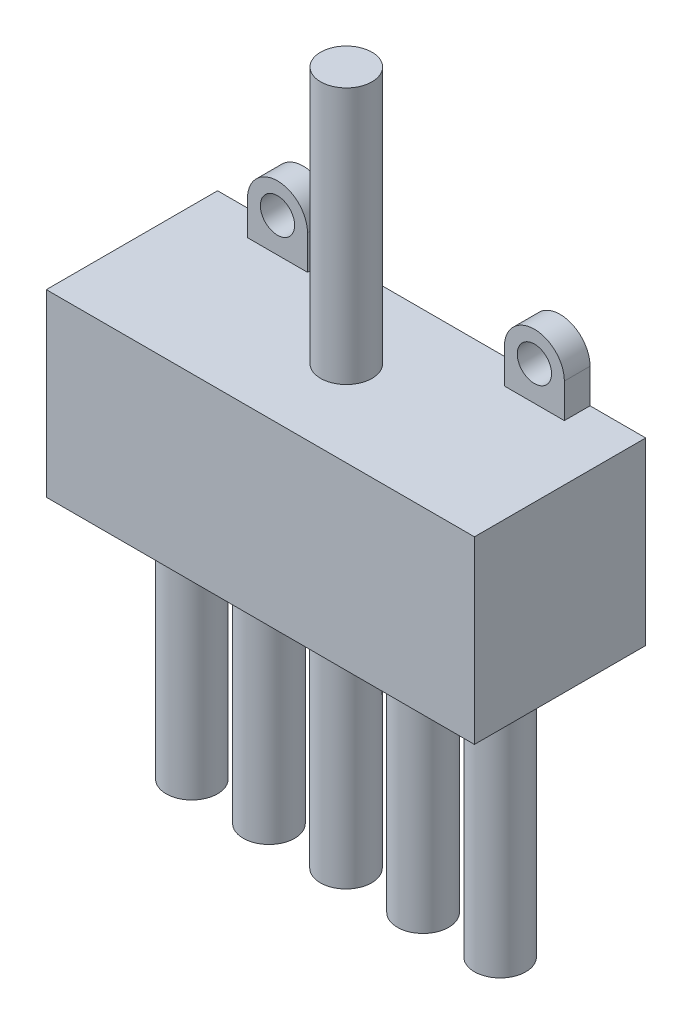
ISO-10303-21;
HEADER;
FILE_DESCRIPTION(('STEP AP214'),'2;1');
FILE_NAME('part.step','',(''),(''),'','','');
FILE_SCHEMA(('AUTOMOTIVE_DESIGN { 1 0 10303 214 1 1 1 1 }'));
ENDSEC;
DATA;
#1=APPLICATION_CONTEXT('core data for automotive mechanical design processes');
#2=APPLICATION_PROTOCOL_DEFINITION('international standard','automotive_design',2000,#1);
#3=PRODUCT_CONTEXT('',#1,'mechanical');
#4=PRODUCT('Part','Part','',(#3));
#5=PRODUCT_RELATED_PRODUCT_CATEGORY('part','',(#4));
#6=PRODUCT_DEFINITION_FORMATION('','',#4);
#7=PRODUCT_DEFINITION_CONTEXT('part definition',#1,'design');
#8=PRODUCT_DEFINITION('design','',#6,#7);
#9=PRODUCT_DEFINITION_SHAPE('','',#8);
#10=(LENGTH_UNIT() NAMED_UNIT(*) SI_UNIT(.MILLI.,.METRE.));
#11=(NAMED_UNIT(*) PLANE_ANGLE_UNIT() SI_UNIT($,.RADIAN.));
#12=(NAMED_UNIT(*) SI_UNIT($,.STERADIAN.) SOLID_ANGLE_UNIT());
#13=UNCERTAINTY_MEASURE_WITH_UNIT(LENGTH_MEASURE(1.E-05),#10,'distance_accuracy_value','');
#14=(GEOMETRIC_REPRESENTATION_CONTEXT(3) GLOBAL_UNCERTAINTY_ASSIGNED_CONTEXT((#13)) GLOBAL_UNIT_ASSIGNED_CONTEXT((#10,
#11,#12)) REPRESENTATION_CONTEXT('',''));
#15=CARTESIAN_POINT('',(0.,0.,0.));
#16=DIRECTION('',(0.,0.,1.));
#17=DIRECTION('',(1.,0.,0.));
#18=AXIS2_PLACEMENT_3D('',#15,#16,#17);
#19=CARTESIAN_POINT('',(-15.,14.5,3.));
#20=DIRECTION('',(0.,0.,-1.));
#21=DIRECTION('',(-1.,0.,0.));
#22=AXIS2_PLACEMENT_3D('',#19,#20,#21);
#23=CYLINDRICAL_SURFACE('',#22,3.5);
#24=CARTESIAN_POINT('',(-15.,14.5,0.));
#25=DIRECTION('',(0.,0.,-1.));
#26=DIRECTION('',(1.,0.,0.));
#27=AXIS2_PLACEMENT_3D('',#24,#25,#26);
#28=CIRCLE('',#27,3.5);
#29=CARTESIAN_POINT('',(-18.5,14.5,0.));
#30=VERTEX_POINT('',#29);
#31=CARTESIAN_POINT('',(-11.5,14.5,0.));
#32=VERTEX_POINT('',#31);
#33=EDGE_CURVE('E108',#30,#32,#28,.T.);
#34=ORIENTED_EDGE('',*,*,#33,.F.);
#35=DIRECTION('',(0.,0.,-1.));
#36=VECTOR('',#35,1.);
#37=CARTESIAN_POINT('',(-18.5,14.5,3.));
#38=LINE('',#37,#36);
#39=CARTESIAN_POINT('',(-18.5,14.5,3.));
#40=VERTEX_POINT('',#39);
#41=EDGE_CURVE('E12',#40,#30,#38,.T.);
#42=ORIENTED_EDGE('',*,*,#41,.F.);
#43=CARTESIAN_POINT('',(-15.,14.5,3.));
#44=DIRECTION('',(0.,0.,-1.));
#45=DIRECTION('',(1.,0.,0.));
#46=AXIS2_PLACEMENT_3D('',#43,#44,#45);
#47=CIRCLE('',#46,3.5);
#48=CARTESIAN_POINT('',(-11.5,14.5,3.));
#49=VERTEX_POINT('',#48);
#50=EDGE_CURVE('E101',#40,#49,#47,.T.);
#51=ORIENTED_EDGE('',*,*,#50,.T.);
#52=DIRECTION('',(0.,0.,-1.));
#53=VECTOR('',#52,1.);
#54=CARTESIAN_POINT('',(-11.5,14.5,3.));
#55=LINE('',#54,#53);
#56=EDGE_CURVE('E46',#49,#32,#55,.T.);
#57=ORIENTED_EDGE('',*,*,#56,.T.);
#58=EDGE_LOOP('',(#34,#42,#51,#57));
#59=FACE_BOUND('',#58,.T.);
#60=ADVANCED_FACE('F43',(#59),#23,.T.);
#61=CARTESIAN_POINT('',(-18.5,14.5,3.));
#62=DIRECTION('',(-1.,0.,0.));
#63=DIRECTION('',(0.,-1.,0.));
#64=AXIS2_PLACEMENT_3D('',#61,#62,#63);
#65=PLANE('',#64);
#66=DIRECTION('',(0.,1.,0.));
#67=VECTOR('',#66,1.);
#68=CARTESIAN_POINT('',(-18.5,14.5,0.));
#69=LINE('',#68,#67);
#70=CARTESIAN_POINT('',(-18.5,10.5,0.));
#71=VERTEX_POINT('',#70);
#72=EDGE_CURVE('E103',#71,#30,#69,.T.);
#73=ORIENTED_EDGE('',*,*,#72,.F.);
#74=DIRECTION('',(0.,0.,-1.));
#75=VECTOR('',#74,1.);
#76=CARTESIAN_POINT('',(-18.5,10.5,3.));
#77=LINE('',#76,#75);
#78=CARTESIAN_POINT('',(-18.5,10.5,3.));
#79=VERTEX_POINT('',#78);
#80=EDGE_CURVE('E52',#79,#71,#77,.T.);
#81=ORIENTED_EDGE('',*,*,#80,.F.);
#82=DIRECTION('',(0.,1.,0.));
#83=VECTOR('',#82,1.);
#84=CARTESIAN_POINT('',(-18.5,14.5,3.));
#85=LINE('',#84,#83);
#86=EDGE_CURVE('E98',#79,#40,#85,.T.);
#87=ORIENTED_EDGE('',*,*,#86,.T.);
#88=ORIENTED_EDGE('',*,*,#41,.T.);
#89=EDGE_LOOP('',(#73,#81,#87,#88));
#90=FACE_BOUND('',#89,.T.);
#91=ADVANCED_FACE('F119',(#90),#65,.T.);
#92=CARTESIAN_POINT('',(-18.5,10.5,3.));
#93=DIRECTION('',(0.,-1.,0.));
#94=DIRECTION('',(0.,0.,-1.));
#95=AXIS2_PLACEMENT_3D('',#92,#93,#94);
#96=PLANE('',#95);
#97=DIRECTION('',(-1.,0.,0.));
#98=VECTOR('',#97,1.);
#99=CARTESIAN_POINT('',(-18.5,10.5,0.));
#100=LINE('',#99,#98);
#101=CARTESIAN_POINT('',(-11.5,10.5,0.));
#102=VERTEX_POINT('',#101);
#103=EDGE_CURVE('E93',#102,#71,#100,.T.);
#104=ORIENTED_EDGE('',*,*,#103,.F.);
#105=DIRECTION('',(0.,0.,-1.));
#106=VECTOR('',#105,1.);
#107=CARTESIAN_POINT('',(-11.5,10.5,3.));
#108=LINE('',#107,#106);
#109=CARTESIAN_POINT('',(-11.5,10.5,3.));
#110=VERTEX_POINT('',#109);
#111=EDGE_CURVE('E88',#110,#102,#108,.T.);
#112=ORIENTED_EDGE('',*,*,#111,.F.);
#113=DIRECTION('',(-1.,0.,0.));
#114=VECTOR('',#113,1.);
#115=CARTESIAN_POINT('',(-18.5,10.5,3.));
#116=LINE('',#115,#114);
#117=EDGE_CURVE('E91',#110,#79,#116,.T.);
#118=ORIENTED_EDGE('',*,*,#117,.T.);
#119=ORIENTED_EDGE('',*,*,#80,.T.);
#120=EDGE_LOOP('',(#104,#112,#118,#119));
#121=FACE_BOUND('',#120,.T.);
#122=ADVANCED_FACE('F90',(#121),#96,.T.);
#123=CARTESIAN_POINT('',(-11.5,14.5,3.));
#124=DIRECTION('',(1.,0.,0.));
#125=DIRECTION('',(0.,0.,-1.));
#126=AXIS2_PLACEMENT_3D('',#123,#124,#125);
#127=PLANE('',#126);
#128=DIRECTION('',(0.,-1.,0.));
#129=VECTOR('',#128,1.);
#130=CARTESIAN_POINT('',(-11.5,14.5,0.));
#131=LINE('',#130,#129);
#132=EDGE_CURVE('E111',#32,#102,#131,.T.);
#133=ORIENTED_EDGE('',*,*,#132,.F.);
#134=ORIENTED_EDGE('',*,*,#56,.F.);
#135=DIRECTION('',(0.,-1.,0.));
#136=VECTOR('',#135,1.);
#137=CARTESIAN_POINT('',(-11.5,14.5,3.));
#138=LINE('',#137,#136);
#139=EDGE_CURVE('E97',#49,#110,#138,.T.);
#140=ORIENTED_EDGE('',*,*,#139,.T.);
#141=ORIENTED_EDGE('',*,*,#111,.T.);
#142=EDGE_LOOP('',(#133,#134,#140,#141));
#143=FACE_BOUND('',#142,.T.);
#144=ADVANCED_FACE('F100',(#143),#127,.T.);
#145=CARTESIAN_POINT('',(-15.,14.5,3.));
#146=DIRECTION('',(0.,0.,1.));
#147=DIRECTION('',(1.,0.,0.));
#148=AXIS2_PLACEMENT_3D('',#145,#146,#147);
#149=PLANE('',#148);
#150=CARTESIAN_POINT('',(-15.,14.5,3.));
#151=DIRECTION('',(0.,0.,-1.));
#152=DIRECTION('',(1.,0.,0.));
#153=AXIS2_PLACEMENT_3D('',#150,#151,#152);
#154=CIRCLE('',#153,2.);
#155=CARTESIAN_POINT('',(-13.,14.5,3.));
#156=VERTEX_POINT('',#155);
#157=EDGE_CURVE('E112',#156,#156,#154,.T.);
#158=ORIENTED_EDGE('',*,*,#157,.T.);
#159=EDGE_LOOP('',(#158));
#160=FACE_BOUND('',#159,.T.);
#161=ORIENTED_EDGE('',*,*,#50,.F.);
#162=ORIENTED_EDGE('',*,*,#86,.F.);
#163=ORIENTED_EDGE('',*,*,#117,.F.);
#164=ORIENTED_EDGE('',*,*,#139,.F.);
#165=EDGE_LOOP('',(#161,#162,#163,#164));
#166=FACE_BOUND('',#165,.T.);
#167=ADVANCED_FACE('F96',(#160,#166),#149,.T.);
#168=CARTESIAN_POINT('',(-15.,14.5,0.));
#169=DIRECTION('',(0.,0.,1.));
#170=DIRECTION('',(1.,0.,0.));
#171=AXIS2_PLACEMENT_3D('',#168,#169,#170);
#172=PLANE('',#171);
#173=CARTESIAN_POINT('',(-15.,14.5,0.));
#174=DIRECTION('',(0.,0.,-1.));
#175=DIRECTION('',(1.,0.,0.));
#176=AXIS2_PLACEMENT_3D('',#173,#174,#175);
#177=CIRCLE('',#176,2.);
#178=CARTESIAN_POINT('',(-13.,14.5,0.));
#179=VERTEX_POINT('',#178);
#180=EDGE_CURVE('E149',#179,#179,#177,.T.);
#181=ORIENTED_EDGE('',*,*,#180,.F.);
#182=EDGE_LOOP('',(#181));
#183=FACE_BOUND('',#182,.T.);
#184=ORIENTED_EDGE('',*,*,#33,.T.);
#185=ORIENTED_EDGE('',*,*,#132,.T.);
#186=ORIENTED_EDGE('',*,*,#103,.T.);
#187=ORIENTED_EDGE('',*,*,#72,.T.);
#188=EDGE_LOOP('',(#184,#185,#186,#187));
#189=FACE_BOUND('',#188,.T.);
#190=ADVANCED_FACE('F118',(#183,#189),#172,.F.);
#191=CARTESIAN_POINT('',(-15.,14.5,3.));
#192=DIRECTION('',(0.,0.,-1.));
#193=DIRECTION('',(-1.,0.,0.));
#194=AXIS2_PLACEMENT_3D('',#191,#192,#193);
#195=CYLINDRICAL_SURFACE('',#194,2.);
#196=ORIENTED_EDGE('',*,*,#157,.F.);
#197=EDGE_LOOP('',(#196));
#198=FACE_BOUND('',#197,.T.);
#199=ORIENTED_EDGE('',*,*,#180,.T.);
#200=EDGE_LOOP('',(#199));
#201=FACE_BOUND('',#200,.T.);
#202=ADVANCED_FACE('F137',(#198,#201),#195,.F.);
#203=CLOSED_SHELL('',(#60,#91,#122,#144,#167,#190,#202));
#204=MANIFOLD_SOLID_BREP('B2',#203);
#205=CARTESIAN_POINT('',(15.,14.5,3.));
#206=DIRECTION('',(0.,0.,-1.));
#207=DIRECTION('',(-1.,0.,0.));
#208=AXIS2_PLACEMENT_3D('',#205,#206,#207);
#209=CYLINDRICAL_SURFACE('',#208,3.5);
#210=CARTESIAN_POINT('',(15.,14.5,0.));
#211=DIRECTION('',(0.,0.,-1.));
#212=DIRECTION('',(-1.,0.,0.));
#213=AXIS2_PLACEMENT_3D('',#210,#211,#212);
#214=CIRCLE('',#213,3.5);
#215=CARTESIAN_POINT('',(11.5,14.5,0.));
#216=VERTEX_POINT('',#215);
#217=CARTESIAN_POINT('',(18.5,14.5,0.));
#218=VERTEX_POINT('',#217);
#219=EDGE_CURVE('E260',#216,#218,#214,.T.);
#220=ORIENTED_EDGE('',*,*,#219,.F.);
#221=DIRECTION('',(0.,0.,-1.));
#222=VECTOR('',#221,1.);
#223=CARTESIAN_POINT('',(11.5,14.5,3.));
#224=LINE('',#223,#222);
#225=CARTESIAN_POINT('',(11.5,14.5,3.));
#226=VERTEX_POINT('',#225);
#227=EDGE_CURVE('E41',#226,#216,#224,.T.);
#228=ORIENTED_EDGE('',*,*,#227,.F.);
#229=CARTESIAN_POINT('',(15.,14.5,3.));
#230=DIRECTION('',(0.,0.,-1.));
#231=DIRECTION('',(-1.,0.,0.));
#232=AXIS2_PLACEMENT_3D('',#229,#230,#231);
#233=CIRCLE('',#232,3.5);
#234=CARTESIAN_POINT('',(18.5,14.5,3.));
#235=VERTEX_POINT('',#234);
#236=EDGE_CURVE('E253',#226,#235,#233,.T.);
#237=ORIENTED_EDGE('',*,*,#236,.T.);
#238=DIRECTION('',(0.,0.,-1.));
#239=VECTOR('',#238,1.);
#240=CARTESIAN_POINT('',(18.5,14.5,3.));
#241=LINE('',#240,#239);
#242=EDGE_CURVE('E198',#235,#218,#241,.T.);
#243=ORIENTED_EDGE('',*,*,#242,.T.);
#244=EDGE_LOOP('',(#220,#228,#237,#243));
#245=FACE_BOUND('',#244,.T.);
#246=ADVANCED_FACE('F195',(#245),#209,.T.);
#247=CARTESIAN_POINT('',(11.5,14.5,3.));
#248=DIRECTION('',(-1.,0.,0.));
#249=DIRECTION('',(0.,0.,1.));
#250=AXIS2_PLACEMENT_3D('',#247,#248,#249);
#251=PLANE('',#250);
#252=DIRECTION('',(0.,1.,0.));
#253=VECTOR('',#252,1.);
#254=CARTESIAN_POINT('',(11.5,14.5,0.));
#255=LINE('',#254,#253);
#256=CARTESIAN_POINT('',(11.5,10.5,0.));
#257=VERTEX_POINT('',#256);
#258=EDGE_CURVE('E255',#257,#216,#255,.T.);
#259=ORIENTED_EDGE('',*,*,#258,.F.);
#260=DIRECTION('',(0.,0.,-1.));
#261=VECTOR('',#260,1.);
#262=CARTESIAN_POINT('',(11.5,10.5,3.));
#263=LINE('',#262,#261);
#264=CARTESIAN_POINT('',(11.5,10.5,3.));
#265=VERTEX_POINT('',#264);
#266=EDGE_CURVE('E204',#265,#257,#263,.T.);
#267=ORIENTED_EDGE('',*,*,#266,.F.);
#268=DIRECTION('',(0.,1.,0.));
#269=VECTOR('',#268,1.);
#270=CARTESIAN_POINT('',(11.5,14.5,3.));
#271=LINE('',#270,#269);
#272=EDGE_CURVE('E250',#265,#226,#271,.T.);
#273=ORIENTED_EDGE('',*,*,#272,.T.);
#274=ORIENTED_EDGE('',*,*,#227,.T.);
#275=EDGE_LOOP('',(#259,#267,#273,#274));
#276=FACE_BOUND('',#275,.T.);
#277=ADVANCED_FACE('F271',(#276),#251,.T.);
#278=CARTESIAN_POINT('',(18.5,10.5,3.));
#279=DIRECTION('',(0.,-1.,0.));
#280=DIRECTION('',(0.,0.,-1.));
#281=AXIS2_PLACEMENT_3D('',#278,#279,#280);
#282=PLANE('',#281);
#283=DIRECTION('',(-1.,0.,0.));
#284=VECTOR('',#283,1.);
#285=CARTESIAN_POINT('',(18.5,10.5,0.));
#286=LINE('',#285,#284);
#287=CARTESIAN_POINT('',(18.5,10.5,0.));
#288=VERTEX_POINT('',#287);
#289=EDGE_CURVE('E245',#288,#257,#286,.T.);
#290=ORIENTED_EDGE('',*,*,#289,.F.);
#291=DIRECTION('',(0.,0.,-1.));
#292=VECTOR('',#291,1.);
#293=CARTESIAN_POINT('',(18.5,10.5,3.));
#294=LINE('',#293,#292);
#295=CARTESIAN_POINT('',(18.5,10.5,3.));
#296=VERTEX_POINT('',#295);
#297=EDGE_CURVE('E240',#296,#288,#294,.T.);
#298=ORIENTED_EDGE('',*,*,#297,.F.);
#299=DIRECTION('',(-1.,0.,0.));
#300=VECTOR('',#299,1.);
#301=CARTESIAN_POINT('',(18.5,10.5,3.));
#302=LINE('',#301,#300);
#303=EDGE_CURVE('E243',#296,#265,#302,.T.);
#304=ORIENTED_EDGE('',*,*,#303,.T.);
#305=ORIENTED_EDGE('',*,*,#266,.T.);
#306=EDGE_LOOP('',(#290,#298,#304,#305));
#307=FACE_BOUND('',#306,.T.);
#308=ADVANCED_FACE('F242',(#307),#282,.T.);
#309=CARTESIAN_POINT('',(18.5,14.5,3.));
#310=DIRECTION('',(1.,0.,0.));
#311=DIRECTION('',(0.,1.,0.));
#312=AXIS2_PLACEMENT_3D('',#309,#310,#311);
#313=PLANE('',#312);
#314=DIRECTION('',(0.,-1.,0.));
#315=VECTOR('',#314,1.);
#316=CARTESIAN_POINT('',(18.5,14.5,0.));
#317=LINE('',#316,#315);
#318=EDGE_CURVE('E263',#218,#288,#317,.T.);
#319=ORIENTED_EDGE('',*,*,#318,.F.);
#320=ORIENTED_EDGE('',*,*,#242,.F.);
#321=DIRECTION('',(0.,-1.,0.));
#322=VECTOR('',#321,1.);
#323=CARTESIAN_POINT('',(18.5,14.5,3.));
#324=LINE('',#323,#322);
#325=EDGE_CURVE('E249',#235,#296,#324,.T.);
#326=ORIENTED_EDGE('',*,*,#325,.T.);
#327=ORIENTED_EDGE('',*,*,#297,.T.);
#328=EDGE_LOOP('',(#319,#320,#326,#327));
#329=FACE_BOUND('',#328,.T.);
#330=ADVANCED_FACE('F252',(#329),#313,.T.);
#331=CARTESIAN_POINT('',(15.,14.5,3.));
#332=DIRECTION('',(0.,0.,-1.));
#333=DIRECTION('',(-1.,0.,0.));
#334=AXIS2_PLACEMENT_3D('',#331,#332,#333);
#335=PLANE('',#334);
#336=CARTESIAN_POINT('',(15.,14.5,3.));
#337=DIRECTION('',(0.,0.,-1.));
#338=DIRECTION('',(-1.,0.,0.));
#339=AXIS2_PLACEMENT_3D('',#336,#337,#338);
#340=CIRCLE('',#339,2.);
#341=CARTESIAN_POINT('',(13.,14.5,3.));
#342=VERTEX_POINT('',#341);
#343=EDGE_CURVE('E264',#342,#342,#340,.T.);
#344=ORIENTED_EDGE('',*,*,#343,.T.);
#345=EDGE_LOOP('',(#344));
#346=FACE_BOUND('',#345,.T.);
#347=ORIENTED_EDGE('',*,*,#236,.F.);
#348=ORIENTED_EDGE('',*,*,#272,.F.);
#349=ORIENTED_EDGE('',*,*,#303,.F.);
#350=ORIENTED_EDGE('',*,*,#325,.F.);
#351=EDGE_LOOP('',(#347,#348,#349,#350));
#352=FACE_BOUND('',#351,.T.);
#353=ADVANCED_FACE('F248',(#346,#352),#335,.F.);
#354=CARTESIAN_POINT('',(15.,14.5,0.));
#355=DIRECTION('',(0.,0.,-1.));
#356=DIRECTION('',(-1.,0.,0.));
#357=AXIS2_PLACEMENT_3D('',#354,#355,#356);
#358=PLANE('',#357);
#359=CARTESIAN_POINT('',(15.,14.5,0.));
#360=DIRECTION('',(0.,0.,-1.));
#361=DIRECTION('',(-1.,0.,0.));
#362=AXIS2_PLACEMENT_3D('',#359,#360,#361);
#363=CIRCLE('',#362,2.);
#364=CARTESIAN_POINT('',(13.,14.5,0.));
#365=VERTEX_POINT('',#364);
#366=EDGE_CURVE('E301',#365,#365,#363,.T.);
#367=ORIENTED_EDGE('',*,*,#366,.F.);
#368=EDGE_LOOP('',(#367));
#369=FACE_BOUND('',#368,.T.);
#370=ORIENTED_EDGE('',*,*,#219,.T.);
#371=ORIENTED_EDGE('',*,*,#318,.T.);
#372=ORIENTED_EDGE('',*,*,#289,.T.);
#373=ORIENTED_EDGE('',*,*,#258,.T.);
#374=EDGE_LOOP('',(#370,#371,#372,#373));
#375=FACE_BOUND('',#374,.T.);
#376=ADVANCED_FACE('F270',(#369,#375),#358,.T.);
#377=CARTESIAN_POINT('',(15.,14.5,3.));
#378=DIRECTION('',(0.,0.,-1.));
#379=DIRECTION('',(-1.,0.,0.));
#380=AXIS2_PLACEMENT_3D('',#377,#378,#379);
#381=CYLINDRICAL_SURFACE('',#380,2.);
#382=ORIENTED_EDGE('',*,*,#343,.F.);
#383=EDGE_LOOP('',(#382));
#384=FACE_BOUND('',#383,.T.);
#385=ORIENTED_EDGE('',*,*,#366,.T.);
#386=EDGE_LOOP('',(#385));
#387=FACE_BOUND('',#386,.T.);
#388=ADVANCED_FACE('F289',(#384,#387),#381,.F.);
#389=CLOSED_SHELL('',(#246,#277,#308,#330,#353,#376,#388));
#390=MANIFOLD_SOLID_BREP('B6',#389);
#391=CARTESIAN_POINT('',(0.,40.5,9.96388265329317));
#392=DIRECTION('',(0.,-1.,0.));
#393=DIRECTION('',(0.,0.,-1.));
#394=AXIS2_PLACEMENT_3D('',#391,#392,#393);
#395=CYLINDRICAL_SURFACE('',#394,3.);
#396=CARTESIAN_POINT('',(0.,40.5,9.96388265329317));
#397=DIRECTION('',(0.,1.,0.));
#398=DIRECTION('',(0.,0.,1.));
#399=AXIS2_PLACEMENT_3D('',#396,#397,#398);
#400=CIRCLE('',#399,3.);
#401=CARTESIAN_POINT('',(0.,40.5,12.9638826532932));
#402=VERTEX_POINT('',#401);
#403=EDGE_CURVE('E194',#402,#402,#400,.T.);
#404=ORIENTED_EDGE('',*,*,#403,.F.);
#405=EDGE_LOOP('',(#404));
#406=FACE_BOUND('',#405,.T.);
#407=CARTESIAN_POINT('',(0.,10.5,9.96388265329317));
#408=DIRECTION('',(0.,1.,0.));
#409=DIRECTION('',(0.,0.,1.));
#410=AXIS2_PLACEMENT_3D('',#407,#408,#409);
#411=CIRCLE('',#410,3.);
#412=CARTESIAN_POINT('',(0.,10.5,12.9638826532932));
#413=VERTEX_POINT('',#412);
#414=EDGE_CURVE('E350',#413,#413,#411,.T.);
#415=ORIENTED_EDGE('',*,*,#414,.T.);
#416=EDGE_LOOP('',(#415));
#417=FACE_BOUND('',#416,.T.);
#418=ADVANCED_FACE('F347',(#406,#417),#395,.T.);
#419=CARTESIAN_POINT('',(0.,40.5,9.96388265329317));
#420=DIRECTION('',(0.,1.,0.));
#421=DIRECTION('',(0.,0.,1.));
#422=AXIS2_PLACEMENT_3D('',#419,#420,#421);
#423=PLANE('',#422);
#424=ORIENTED_EDGE('',*,*,#403,.T.);
#425=EDGE_LOOP('',(#424));
#426=FACE_BOUND('',#425,.T.);
#427=ADVANCED_FACE('F362',(#426),#423,.T.);
#428=CARTESIAN_POINT('',(0.,10.5,9.96388265329317));
#429=DIRECTION('',(0.,1.,0.));
#430=DIRECTION('',(0.,0.,1.));
#431=AXIS2_PLACEMENT_3D('',#428,#429,#430);
#432=PLANE('',#431);
#433=ORIENTED_EDGE('',*,*,#414,.F.);
#434=EDGE_LOOP('',(#433));
#435=FACE_BOUND('',#434,.T.);
#436=ADVANCED_FACE('F360',(#435),#432,.F.);
#437=CLOSED_SHELL('',(#418,#427,#436));
#438=MANIFOLD_SOLID_BREP('B35',#437);
#439=CARTESIAN_POINT('',(-8.99999999999999,-40.5,10.));
#440=DIRECTION('',(0.,1.,0.));
#441=DIRECTION('',(0.,0.,1.));
#442=AXIS2_PLACEMENT_3D('',#439,#440,#441);
#443=CYLINDRICAL_SURFACE('',#442,3.);
#444=CARTESIAN_POINT('',(-8.99999999999999,-40.5,10.));
#445=DIRECTION('',(0.,-1.,0.));
#446=DIRECTION('',(0.,0.,1.));
#447=AXIS2_PLACEMENT_3D('',#444,#445,#446);
#448=CIRCLE('',#447,3.);
#449=CARTESIAN_POINT('',(-8.99999999999999,-40.5,13.));
#450=VERTEX_POINT('',#449);
#451=EDGE_CURVE('E346',#450,#450,#448,.T.);
#452=ORIENTED_EDGE('',*,*,#451,.F.);
#453=EDGE_LOOP('',(#452));
#454=FACE_BOUND('',#453,.T.);
#455=CARTESIAN_POINT('',(-8.99999999999999,-10.5,10.));
#456=DIRECTION('',(0.,-1.,0.));
#457=DIRECTION('',(0.,0.,1.));
#458=AXIS2_PLACEMENT_3D('',#455,#456,#457);
#459=CIRCLE('',#458,3.);
#460=CARTESIAN_POINT('',(-8.99999999999999,-10.5,13.));
#461=VERTEX_POINT('',#460);
#462=EDGE_CURVE('E398',#461,#461,#459,.T.);
#463=ORIENTED_EDGE('',*,*,#462,.T.);
#464=EDGE_LOOP('',(#463));
#465=FACE_BOUND('',#464,.T.);
#466=ADVANCED_FACE('F395',(#454,#465),#443,.T.);
#467=CARTESIAN_POINT('',(-8.99999999999999,-40.5,10.));
#468=DIRECTION('',(0.,1.,0.));
#469=DIRECTION('',(0.,0.,1.));
#470=AXIS2_PLACEMENT_3D('',#467,#468,#469);
#471=PLANE('',#470);
#472=ORIENTED_EDGE('',*,*,#451,.T.);
#473=EDGE_LOOP('',(#472));
#474=FACE_BOUND('',#473,.T.);
#475=ADVANCED_FACE('F410',(#474),#471,.F.);
#476=CARTESIAN_POINT('',(-8.99999999999999,-10.5,10.));
#477=DIRECTION('',(0.,1.,0.));
#478=DIRECTION('',(0.,0.,1.));
#479=AXIS2_PLACEMENT_3D('',#476,#477,#478);
#480=PLANE('',#479);
#481=ORIENTED_EDGE('',*,*,#462,.F.);
#482=EDGE_LOOP('',(#481));
#483=FACE_BOUND('',#482,.T.);
#484=ADVANCED_FACE('F408',(#483),#480,.T.);
#485=CLOSED_SHELL('',(#466,#475,#484));
#486=MANIFOLD_SOLID_BREP('B189',#485);
#487=CARTESIAN_POINT('',(18.,-40.5,10.));
#488=DIRECTION('',(0.,1.,0.));
#489=DIRECTION('',(0.,0.,1.));
#490=AXIS2_PLACEMENT_3D('',#487,#488,#489);
#491=CYLINDRICAL_SURFACE('',#490,3.);
#492=CARTESIAN_POINT('',(18.,-40.5,10.));
#493=DIRECTION('',(0.,-1.,0.));
#494=DIRECTION('',(0.,0.,-1.));
#495=AXIS2_PLACEMENT_3D('',#492,#493,#494);
#496=CIRCLE('',#495,3.);
#497=CARTESIAN_POINT('',(18.,-40.5,7.));
#498=VERTEX_POINT('',#497);
#499=EDGE_CURVE('E394',#498,#498,#496,.T.);
#500=ORIENTED_EDGE('',*,*,#499,.F.);
#501=EDGE_LOOP('',(#500));
#502=FACE_BOUND('',#501,.T.);
#503=CARTESIAN_POINT('',(18.,-10.5,10.));
#504=DIRECTION('',(0.,-1.,0.));
#505=DIRECTION('',(0.,0.,-1.));
#506=AXIS2_PLACEMENT_3D('',#503,#504,#505);
#507=CIRCLE('',#506,3.);
#508=CARTESIAN_POINT('',(18.,-10.5,7.));
#509=VERTEX_POINT('',#508);
#510=EDGE_CURVE('E446',#509,#509,#507,.T.);
#511=ORIENTED_EDGE('',*,*,#510,.T.);
#512=EDGE_LOOP('',(#511));
#513=FACE_BOUND('',#512,.T.);
#514=ADVANCED_FACE('F443',(#502,#513),#491,.T.);
#515=CARTESIAN_POINT('',(18.,-40.5,10.));
#516=DIRECTION('',(0.,-1.,0.));
#517=DIRECTION('',(0.,0.,-1.));
#518=AXIS2_PLACEMENT_3D('',#515,#516,#517);
#519=PLANE('',#518);
#520=ORIENTED_EDGE('',*,*,#499,.T.);
#521=EDGE_LOOP('',(#520));
#522=FACE_BOUND('',#521,.T.);
#523=ADVANCED_FACE('F458',(#522),#519,.T.);
#524=CARTESIAN_POINT('',(18.,-10.5,10.));
#525=DIRECTION('',(0.,-1.,0.));
#526=DIRECTION('',(0.,0.,-1.));
#527=AXIS2_PLACEMENT_3D('',#524,#525,#526);
#528=PLANE('',#527);
#529=ORIENTED_EDGE('',*,*,#510,.F.);
#530=EDGE_LOOP('',(#529));
#531=FACE_BOUND('',#530,.T.);
#532=ADVANCED_FACE('F456',(#531),#528,.F.);
#533=CLOSED_SHELL('',(#514,#523,#532));
#534=MANIFOLD_SOLID_BREP('B341',#533);
#535=CARTESIAN_POINT('',(8.99999999999999,-40.5,10.));
#536=DIRECTION('',(0.,1.,0.));
#537=DIRECTION('',(0.,0.,1.));
#538=AXIS2_PLACEMENT_3D('',#535,#536,#537);
#539=CYLINDRICAL_SURFACE('',#538,3.);
#540=CARTESIAN_POINT('',(8.99999999999999,-40.5,10.));
#541=DIRECTION('',(0.,-1.,0.));
#542=DIRECTION('',(0.,0.,-1.));
#543=AXIS2_PLACEMENT_3D('',#540,#541,#542);
#544=CIRCLE('',#543,3.);
#545=CARTESIAN_POINT('',(8.99999999999999,-40.5,7.));
#546=VERTEX_POINT('',#545);
#547=EDGE_CURVE('E442',#546,#546,#544,.T.);
#548=ORIENTED_EDGE('',*,*,#547,.F.);
#549=EDGE_LOOP('',(#548));
#550=FACE_BOUND('',#549,.T.);
#551=CARTESIAN_POINT('',(8.99999999999999,-10.5,10.));
#552=DIRECTION('',(0.,-1.,0.));
#553=DIRECTION('',(0.,0.,-1.));
#554=AXIS2_PLACEMENT_3D('',#551,#552,#553);
#555=CIRCLE('',#554,3.);
#556=CARTESIAN_POINT('',(8.99999999999999,-10.5,7.));
#557=VERTEX_POINT('',#556);
#558=EDGE_CURVE('E494',#557,#557,#555,.T.);
#559=ORIENTED_EDGE('',*,*,#558,.T.);
#560=EDGE_LOOP('',(#559));
#561=FACE_BOUND('',#560,.T.);
#562=ADVANCED_FACE('F491',(#550,#561),#539,.T.);
#563=CARTESIAN_POINT('',(8.99999999999999,-40.5,10.));
#564=DIRECTION('',(0.,-1.,0.));
#565=DIRECTION('',(0.,0.,-1.));
#566=AXIS2_PLACEMENT_3D('',#563,#564,#565);
#567=PLANE('',#566);
#568=ORIENTED_EDGE('',*,*,#547,.T.);
#569=EDGE_LOOP('',(#568));
#570=FACE_BOUND('',#569,.T.);
#571=ADVANCED_FACE('F506',(#570),#567,.T.);
#572=CARTESIAN_POINT('',(8.99999999999999,-10.5,10.));
#573=DIRECTION('',(0.,-1.,0.));
#574=DIRECTION('',(0.,0.,-1.));
#575=AXIS2_PLACEMENT_3D('',#572,#573,#574);
#576=PLANE('',#575);
#577=ORIENTED_EDGE('',*,*,#558,.F.);
#578=EDGE_LOOP('',(#577));
#579=FACE_BOUND('',#578,.T.);
#580=ADVANCED_FACE('F504',(#579),#576,.F.);
#581=CLOSED_SHELL('',(#562,#571,#580));
#582=MANIFOLD_SOLID_BREP('B389',#581);
#583=CARTESIAN_POINT('',(-18.,-40.5,10.));
#584=DIRECTION('',(0.,1.,0.));
#585=DIRECTION('',(0.,0.,1.));
#586=AXIS2_PLACEMENT_3D('',#583,#584,#585);
#587=CYLINDRICAL_SURFACE('',#586,3.);
#588=CARTESIAN_POINT('',(-18.,-40.5,10.));
#589=DIRECTION('',(0.,-1.,0.));
#590=DIRECTION('',(0.,0.,1.));
#591=AXIS2_PLACEMENT_3D('',#588,#589,#590);
#592=CIRCLE('',#591,3.);
#593=CARTESIAN_POINT('',(-18.,-40.5,13.));
#594=VERTEX_POINT('',#593);
#595=EDGE_CURVE('E490',#594,#594,#592,.T.);
#596=ORIENTED_EDGE('',*,*,#595,.F.);
#597=EDGE_LOOP('',(#596));
#598=FACE_BOUND('',#597,.T.);
#599=CARTESIAN_POINT('',(-18.,-10.5,10.));
#600=DIRECTION('',(0.,-1.,0.));
#601=DIRECTION('',(0.,0.,1.));
#602=AXIS2_PLACEMENT_3D('',#599,#600,#601);
#603=CIRCLE('',#602,3.);
#604=CARTESIAN_POINT('',(-18.,-10.5,13.));
#605=VERTEX_POINT('',#604);
#606=EDGE_CURVE('E542',#605,#605,#603,.T.);
#607=ORIENTED_EDGE('',*,*,#606,.T.);
#608=EDGE_LOOP('',(#607));
#609=FACE_BOUND('',#608,.T.);
#610=ADVANCED_FACE('F539',(#598,#609),#587,.T.);
#611=CARTESIAN_POINT('',(-18.,-40.5,10.));
#612=DIRECTION('',(0.,1.,0.));
#613=DIRECTION('',(0.,0.,1.));
#614=AXIS2_PLACEMENT_3D('',#611,#612,#613);
#615=PLANE('',#614);
#616=ORIENTED_EDGE('',*,*,#595,.T.);
#617=EDGE_LOOP('',(#616));
#618=FACE_BOUND('',#617,.T.);
#619=ADVANCED_FACE('F554',(#618),#615,.F.);
#620=CARTESIAN_POINT('',(-18.,-10.5,10.));
#621=DIRECTION('',(0.,1.,0.));
#622=DIRECTION('',(0.,0.,1.));
#623=AXIS2_PLACEMENT_3D('',#620,#621,#622);
#624=PLANE('',#623);
#625=ORIENTED_EDGE('',*,*,#606,.F.);
#626=EDGE_LOOP('',(#625));
#627=FACE_BOUND('',#626,.T.);
#628=ADVANCED_FACE('F552',(#627),#624,.T.);
#629=CLOSED_SHELL('',(#610,#619,#628));
#630=MANIFOLD_SOLID_BREP('B437',#629);
#631=CARTESIAN_POINT('',(0.,-40.5,10.));
#632=DIRECTION('',(0.,1.,0.));
#633=DIRECTION('',(0.,0.,1.));
#634=AXIS2_PLACEMENT_3D('',#631,#632,#633);
#635=CYLINDRICAL_SURFACE('',#634,3.);
#636=CARTESIAN_POINT('',(0.,-40.5,10.));
#637=DIRECTION('',(0.,-1.,0.));
#638=DIRECTION('',(0.,0.,-1.));
#639=AXIS2_PLACEMENT_3D('',#636,#637,#638);
#640=CIRCLE('',#639,3.);
#641=CARTESIAN_POINT('',(0.,-40.5,7.));
#642=VERTEX_POINT('',#641);
#643=EDGE_CURVE('E538',#642,#642,#640,.T.);
#644=ORIENTED_EDGE('',*,*,#643,.F.);
#645=EDGE_LOOP('',(#644));
#646=FACE_BOUND('',#645,.T.);
#647=CARTESIAN_POINT('',(0.,-10.5,10.));
#648=DIRECTION('',(0.,-1.,0.));
#649=DIRECTION('',(0.,0.,-1.));
#650=AXIS2_PLACEMENT_3D('',#647,#648,#649);
#651=CIRCLE('',#650,3.);
#652=CARTESIAN_POINT('',(0.,-10.5,7.));
#653=VERTEX_POINT('',#652);
#654=EDGE_CURVE('E591',#653,#653,#651,.T.);
#655=ORIENTED_EDGE('',*,*,#654,.T.);
#656=EDGE_LOOP('',(#655));
#657=FACE_BOUND('',#656,.T.);
#658=ADVANCED_FACE('F588',(#646,#657),#635,.T.);
#659=CARTESIAN_POINT('',(0.,-40.5,10.));
#660=DIRECTION('',(0.,-1.,0.));
#661=DIRECTION('',(0.,0.,-1.));
#662=AXIS2_PLACEMENT_3D('',#659,#660,#661);
#663=PLANE('',#662);
#664=ORIENTED_EDGE('',*,*,#643,.T.);
#665=EDGE_LOOP('',(#664));
#666=FACE_BOUND('',#665,.T.);
#667=ADVANCED_FACE('F603',(#666),#663,.T.);
#668=CARTESIAN_POINT('',(0.,-10.5,10.));
#669=DIRECTION('',(0.,-1.,0.));
#670=DIRECTION('',(0.,0.,-1.));
#671=AXIS2_PLACEMENT_3D('',#668,#669,#670);
#672=PLANE('',#671);
#673=ORIENTED_EDGE('',*,*,#654,.F.);
#674=EDGE_LOOP('',(#673));
#675=FACE_BOUND('',#674,.T.);
#676=ADVANCED_FACE('F601',(#675),#672,.F.);
#677=CLOSED_SHELL('',(#658,#667,#676));
#678=MANIFOLD_SOLID_BREP('B485',#677);
#679=CARTESIAN_POINT('',(25.,10.5,20.));
#680=DIRECTION('',(-1.,0.,0.));
#681=DIRECTION('',(0.,0.,1.));
#682=AXIS2_PLACEMENT_3D('',#679,#680,#681);
#683=PLANE('',#682);
#684=DIRECTION('',(0.,1.,0.));
#685=VECTOR('',#684,1.);
#686=CARTESIAN_POINT('',(25.,10.5,0.));
#687=LINE('',#686,#685);
#688=CARTESIAN_POINT('',(25.,-10.5,0.));
#689=VERTEX_POINT('',#688);
#690=CARTESIAN_POINT('',(25.,10.5,0.));
#691=VERTEX_POINT('',#690);
#692=EDGE_CURVE('E691',#689,#691,#687,.T.);
#693=ORIENTED_EDGE('',*,*,#692,.T.);
#694=DIRECTION('',(0.,0.,-1.));
#695=VECTOR('',#694,1.);
#696=CARTESIAN_POINT('',(25.,10.5,20.));
#697=LINE('',#696,#695);
#698=CARTESIAN_POINT('',(25.,10.5,20.));
#699=VERTEX_POINT('',#698);
#700=EDGE_CURVE('E586',#699,#691,#697,.T.);
#701=ORIENTED_EDGE('',*,*,#700,.F.);
#702=DIRECTION('',(0.,1.,0.));
#703=VECTOR('',#702,1.);
#704=CARTESIAN_POINT('',(25.,10.5,20.));
#705=LINE('',#704,#703);
#706=CARTESIAN_POINT('',(25.,-10.5,20.));
#707=VERTEX_POINT('',#706);
#708=EDGE_CURVE('E679',#707,#699,#705,.T.);
#709=ORIENTED_EDGE('',*,*,#708,.F.);
#710=DIRECTION('',(0.,0.,-1.));
#711=VECTOR('',#710,1.);
#712=CARTESIAN_POINT('',(25.,-10.5,20.));
#713=LINE('',#712,#711);
#714=EDGE_CURVE('E687',#707,#689,#713,.T.);
#715=ORIENTED_EDGE('',*,*,#714,.T.);
#716=EDGE_LOOP('',(#693,#701,#709,#715));
#717=FACE_BOUND('',#716,.T.);
#718=ADVANCED_FACE('F628',(#717),#683,.F.);
#719=CARTESIAN_POINT('',(-25.,10.5,20.));
#720=DIRECTION('',(0.,-1.,0.));
#721=DIRECTION('',(0.,0.,-1.));
#722=AXIS2_PLACEMENT_3D('',#719,#720,#721);
#723=PLANE('',#722);
#724=DIRECTION('',(-1.,0.,0.));
#725=VECTOR('',#724,1.);
#726=CARTESIAN_POINT('',(-25.,10.5,0.));
#727=LINE('',#726,#725);
#728=CARTESIAN_POINT('',(-25.,10.5,0.));
#729=VERTEX_POINT('',#728);
#730=EDGE_CURVE('E683',#691,#729,#727,.T.);
#731=ORIENTED_EDGE('',*,*,#730,.T.);
#732=DIRECTION('',(0.,0.,-1.));
#733=VECTOR('',#732,1.);
#734=CARTESIAN_POINT('',(-25.,10.5,20.));
#735=LINE('',#734,#733);
#736=CARTESIAN_POINT('',(-25.,10.5,20.));
#737=VERTEX_POINT('',#736);
#738=EDGE_CURVE('E636',#737,#729,#735,.T.);
#739=ORIENTED_EDGE('',*,*,#738,.F.);
#740=DIRECTION('',(-1.,0.,0.));
#741=VECTOR('',#740,1.);
#742=CARTESIAN_POINT('',(-25.,10.5,20.));
#743=LINE('',#742,#741);
#744=EDGE_CURVE('E674',#699,#737,#743,.T.);
#745=ORIENTED_EDGE('',*,*,#744,.F.);
#746=ORIENTED_EDGE('',*,*,#700,.T.);
#747=EDGE_LOOP('',(#731,#739,#745,#746));
#748=FACE_BOUND('',#747,.T.);
#749=ADVANCED_FACE('F682',(#748),#723,.F.);
#750=CARTESIAN_POINT('',(-25.,10.5,20.));
#751=DIRECTION('',(1.,0.,0.));
#752=DIRECTION('',(0.,0.,-1.));
#753=AXIS2_PLACEMENT_3D('',#750,#751,#752);
#754=PLANE('',#753);
#755=DIRECTION('',(0.,-1.,0.));
#756=VECTOR('',#755,1.);
#757=CARTESIAN_POINT('',(-25.,10.5,0.));
#758=LINE('',#757,#756);
#759=CARTESIAN_POINT('',(-25.,-10.5,0.));
#760=VERTEX_POINT('',#759);
#761=EDGE_CURVE('E661',#729,#760,#758,.T.);
#762=ORIENTED_EDGE('',*,*,#761,.T.);
#763=DIRECTION('',(0.,0.,-1.));
#764=VECTOR('',#763,1.);
#765=CARTESIAN_POINT('',(-25.,-10.5,20.));
#766=LINE('',#765,#764);
#767=CARTESIAN_POINT('',(-25.,-10.5,20.));
#768=VERTEX_POINT('',#767);
#769=EDGE_CURVE('E684',#768,#760,#766,.T.);
#770=ORIENTED_EDGE('',*,*,#769,.F.);
#771=DIRECTION('',(0.,-1.,0.));
#772=VECTOR('',#771,1.);
#773=CARTESIAN_POINT('',(-25.,10.5,20.));
#774=LINE('',#773,#772);
#775=EDGE_CURVE('E677',#737,#768,#774,.T.);
#776=ORIENTED_EDGE('',*,*,#775,.F.);
#777=ORIENTED_EDGE('',*,*,#738,.T.);
#778=EDGE_LOOP('',(#762,#770,#776,#777));
#779=FACE_BOUND('',#778,.T.);
#780=ADVANCED_FACE('F685',(#779),#754,.F.);
#781=CARTESIAN_POINT('',(-25.,-10.5,20.));
#782=DIRECTION('',(0.,1.,0.));
#783=DIRECTION('',(0.,0.,1.));
#784=AXIS2_PLACEMENT_3D('',#781,#782,#783);
#785=PLANE('',#784);
#786=DIRECTION('',(1.,0.,0.));
#787=VECTOR('',#786,1.);
#788=CARTESIAN_POINT('',(-25.,-10.5,0.));
#789=LINE('',#788,#787);
#790=EDGE_CURVE('E667',#760,#689,#789,.T.);
#791=ORIENTED_EDGE('',*,*,#790,.T.);
#792=ORIENTED_EDGE('',*,*,#714,.F.);
#793=DIRECTION('',(1.,0.,0.));
#794=VECTOR('',#793,1.);
#795=CARTESIAN_POINT('',(-25.,-10.5,20.));
#796=LINE('',#795,#794);
#797=EDGE_CURVE('E644',#768,#707,#796,.T.);
#798=ORIENTED_EDGE('',*,*,#797,.F.);
#799=ORIENTED_EDGE('',*,*,#769,.T.);
#800=EDGE_LOOP('',(#791,#792,#798,#799));
#801=FACE_BOUND('',#800,.T.);
#802=ADVANCED_FACE('F698',(#801),#785,.F.);
#803=CARTESIAN_POINT('',(0.,0.,20.));
#804=DIRECTION('',(0.,0.,1.));
#805=DIRECTION('',(1.,0.,0.));
#806=AXIS2_PLACEMENT_3D('',#803,#804,#805);
#807=PLANE('',#806);
#808=ORIENTED_EDGE('',*,*,#708,.T.);
#809=ORIENTED_EDGE('',*,*,#744,.T.);
#810=ORIENTED_EDGE('',*,*,#775,.T.);
#811=ORIENTED_EDGE('',*,*,#797,.T.);
#812=EDGE_LOOP('',(#808,#809,#810,#811));
#813=FACE_BOUND('',#812,.T.);
#814=ADVANCED_FACE('F675',(#813),#807,.T.);
#815=CARTESIAN_POINT('',(0.,0.,0.));
#816=DIRECTION('',(0.,0.,1.));
#817=DIRECTION('',(1.,0.,0.));
#818=AXIS2_PLACEMENT_3D('',#815,#816,#817);
#819=PLANE('',#818);
#820=ORIENTED_EDGE('',*,*,#692,.F.);
#821=ORIENTED_EDGE('',*,*,#790,.F.);
#822=ORIENTED_EDGE('',*,*,#761,.F.);
#823=ORIENTED_EDGE('',*,*,#730,.F.);
#824=EDGE_LOOP('',(#820,#821,#822,#823));
#825=FACE_BOUND('',#824,.T.);
#826=ADVANCED_FACE('F701',(#825),#819,.F.);
#827=CLOSED_SHELL('',(#718,#749,#780,#802,#814,#826));
#828=MANIFOLD_SOLID_BREP('B533',#827);
#829=ADVANCED_BREP_SHAPE_REPRESENTATION('',(#18,#204,#390,#438,#486,#534,#582,#630,#678,#828),#14);
#830=SHAPE_DEFINITION_REPRESENTATION(#9,#829);
ENDSEC;
END-ISO-10303-21;
